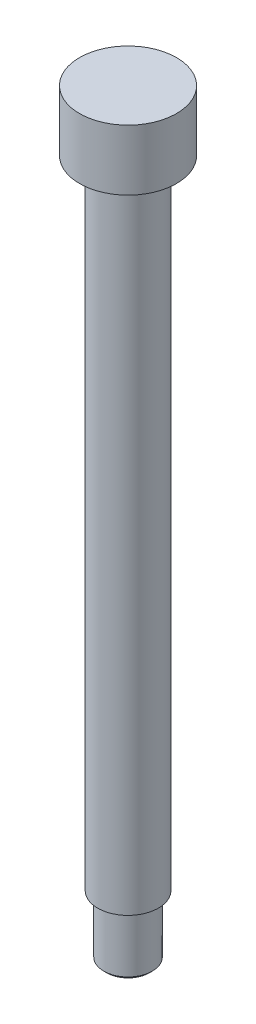
ISO-10303-21;
HEADER;
FILE_DESCRIPTION(('STEP AP214'),'2;1');
FILE_NAME('part.step','',(''),(''),'','','');
FILE_SCHEMA(('AUTOMOTIVE_DESIGN { 1 0 10303 214 1 1 1 1 }'));
ENDSEC;
DATA;
#1=APPLICATION_CONTEXT('core data for automotive mechanical design processes');
#2=APPLICATION_PROTOCOL_DEFINITION('international standard','automotive_design',2000,#1);
#3=PRODUCT_CONTEXT('',#1,'mechanical');
#4=PRODUCT('Part','Part','',(#3));
#5=PRODUCT_RELATED_PRODUCT_CATEGORY('part','',(#4));
#6=PRODUCT_DEFINITION_FORMATION('','',#4);
#7=PRODUCT_DEFINITION_CONTEXT('part definition',#1,'design');
#8=PRODUCT_DEFINITION('design','',#6,#7);
#9=PRODUCT_DEFINITION_SHAPE('','',#8);
#10=(LENGTH_UNIT() NAMED_UNIT(*) SI_UNIT(.MILLI.,.METRE.));
#11=(NAMED_UNIT(*) PLANE_ANGLE_UNIT() SI_UNIT($,.RADIAN.));
#12=(NAMED_UNIT(*) SI_UNIT($,.STERADIAN.) SOLID_ANGLE_UNIT());
#13=UNCERTAINTY_MEASURE_WITH_UNIT(LENGTH_MEASURE(1.E-05),#10,'distance_accuracy_value','');
#14=(GEOMETRIC_REPRESENTATION_CONTEXT(3) GLOBAL_UNCERTAINTY_ASSIGNED_CONTEXT((#13)) GLOBAL_UNIT_ASSIGNED_CONTEXT((#10,
#11,#12)) REPRESENTATION_CONTEXT('',''));
#15=CARTESIAN_POINT('',(0.,0.,0.));
#16=DIRECTION('',(0.,0.,1.));
#17=DIRECTION('',(1.,0.,0.));
#18=AXIS2_PLACEMENT_3D('',#15,#16,#17);
#19=CARTESIAN_POINT('',(0.,0.,0.));
#20=DIRECTION('',(0.,1.,0.));
#21=DIRECTION('',(0.,0.,1.));
#22=AXIS2_PLACEMENT_3D('',#19,#20,#21);
#23=PLANE('',#22);
#24=CARTESIAN_POINT('',(0.,0.,0.));
#25=DIRECTION('',(0.,-1.,0.));
#26=DIRECTION('',(0.,0.,-1.));
#27=AXIS2_PLACEMENT_3D('',#24,#25,#26);
#28=CIRCLE('',#27,8.);
#29=CARTESIAN_POINT('',(0.,0.,-8.));
#30=VERTEX_POINT('',#29);
#31=EDGE_CURVE('E61',#30,#30,#28,.T.);
#32=ORIENTED_EDGE('',*,*,#31,.F.);
#33=EDGE_LOOP('',(#32));
#34=FACE_BOUND('',#33,.T.);
#35=ADVANCED_FACE('F49',(#34),#23,.T.);
#36=CARTESIAN_POINT('',(0.,-130.,0.));
#37=DIRECTION('',(0.,-1.,0.));
#38=DIRECTION('',(0.,0.,-1.));
#39=AXIS2_PLACEMENT_3D('',#36,#37,#38);
#40=CYLINDRICAL_SURFACE('',#39,8.);
#41=ORIENTED_EDGE('',*,*,#31,.T.);
#42=EDGE_LOOP('',(#41));
#43=FACE_BOUND('',#42,.T.);
#44=CARTESIAN_POINT('',(0.,-9.99999999999999,0.));
#45=DIRECTION('',(0.,-1.,0.));
#46=DIRECTION('',(0.,0.,-1.));
#47=AXIS2_PLACEMENT_3D('',#44,#45,#46);
#48=CIRCLE('',#47,8.);
#49=CARTESIAN_POINT('',(0.,-9.99999999999999,-8.));
#50=VERTEX_POINT('',#49);
#51=EDGE_CURVE('E65',#50,#50,#48,.T.);
#52=ORIENTED_EDGE('',*,*,#51,.F.);
#53=EDGE_LOOP('',(#52));
#54=FACE_BOUND('',#53,.T.);
#55=ADVANCED_FACE('F98',(#43,#54),#40,.T.);
#56=CARTESIAN_POINT('',(5.,-10.,0.));
#57=DIRECTION('',(0.,-1.,0.));
#58=DIRECTION('',(0.,0.,-1.));
#59=AXIS2_PLACEMENT_3D('',#56,#57,#58);
#60=PLANE('',#59);
#61=ORIENTED_EDGE('',*,*,#51,.T.);
#62=EDGE_LOOP('',(#61));
#63=FACE_BOUND('',#62,.T.);
#64=CARTESIAN_POINT('',(0.,-9.99999999999999,0.));
#65=DIRECTION('',(0.,-1.,0.));
#66=DIRECTION('',(0.,0.,-1.));
#67=AXIS2_PLACEMENT_3D('',#64,#65,#66);
#68=CIRCLE('',#67,5.);
#69=CARTESIAN_POINT('',(0.,-9.99999999999999,-5.));
#70=VERTEX_POINT('',#69);
#71=EDGE_CURVE('E70',#70,#70,#68,.T.);
#72=ORIENTED_EDGE('',*,*,#71,.F.);
#73=EDGE_LOOP('',(#72));
#74=FACE_BOUND('',#73,.T.);
#75=ADVANCED_FACE('F94',(#63,#74),#60,.T.);
#76=CARTESIAN_POINT('',(0.,-130.,0.));
#77=DIRECTION('',(0.,-1.,0.));
#78=DIRECTION('',(0.,0.,-1.));
#79=AXIS2_PLACEMENT_3D('',#76,#77,#78);
#80=CYLINDRICAL_SURFACE('',#79,5.00000000000001);
#81=ORIENTED_EDGE('',*,*,#71,.T.);
#82=EDGE_LOOP('',(#81));
#83=FACE_BOUND('',#82,.T.);
#84=CARTESIAN_POINT('',(0.,-115.,0.));
#85=DIRECTION('',(0.,-1.,0.));
#86=DIRECTION('',(0.,0.,-1.));
#87=AXIS2_PLACEMENT_3D('',#84,#85,#86);
#88=CIRCLE('',#87,5.00000000000001);
#89=CARTESIAN_POINT('',(0.,-115.,-5.00000000000001));
#90=VERTEX_POINT('',#89);
#91=EDGE_CURVE('E73',#90,#90,#88,.T.);
#92=ORIENTED_EDGE('',*,*,#91,.F.);
#93=EDGE_LOOP('',(#92));
#94=FACE_BOUND('',#93,.T.);
#95=ADVANCED_FACE('F84',(#83,#94),#80,.T.);
#96=CARTESIAN_POINT('',(5.00000000000001,-115.,0.));
#97=DIRECTION('',(0.,-1.,0.));
#98=DIRECTION('',(0.,0.,-1.));
#99=AXIS2_PLACEMENT_3D('',#96,#97,#98);
#100=PLANE('',#99);
#101=ORIENTED_EDGE('',*,*,#91,.T.);
#102=EDGE_LOOP('',(#101));
#103=FACE_BOUND('',#102,.T.);
#104=CARTESIAN_POINT('',(0.,-115.,0.));
#105=DIRECTION('',(0.,-1.,0.));
#106=DIRECTION('',(0.,0.,-1.));
#107=AXIS2_PLACEMENT_3D('',#104,#105,#106);
#108=CIRCLE('',#107,4.);
#109=CARTESIAN_POINT('',(0.,-115.,-4.));
#110=VERTEX_POINT('',#109);
#111=EDGE_CURVE('E76',#110,#110,#108,.T.);
#112=ORIENTED_EDGE('',*,*,#111,.F.);
#113=EDGE_LOOP('',(#112));
#114=FACE_BOUND('',#113,.T.);
#115=ADVANCED_FACE('F82',(#103,#114),#100,.T.);
#116=CARTESIAN_POINT('',(0.,-130.,0.));
#117=DIRECTION('',(0.,-1.,0.));
#118=DIRECTION('',(0.,0.,-1.));
#119=AXIS2_PLACEMENT_3D('',#116,#117,#118);
#120=CYLINDRICAL_SURFACE('',#119,4.);
#121=CARTESIAN_POINT('',(0.,-124.5,0.));
#122=DIRECTION('',(0.,-1.,0.));
#123=DIRECTION('',(0.,0.,-1.));
#124=AXIS2_PLACEMENT_3D('',#121,#122,#123);
#125=CIRCLE('',#124,4.);
#126=CARTESIAN_POINT('',(0.,-124.5,-4.));
#127=VERTEX_POINT('',#126);
#128=EDGE_CURVE('E10',#127,#127,#125,.F.);
#129=ORIENTED_EDGE('',*,*,#128,.T.);
#130=EDGE_LOOP('',(#129));
#131=FACE_BOUND('',#130,.T.);
#132=ORIENTED_EDGE('',*,*,#111,.T.);
#133=EDGE_LOOP('',(#132));
#134=FACE_BOUND('',#133,.T.);
#135=ADVANCED_FACE('F80',(#131,#134),#120,.T.);
#136=CARTESIAN_POINT('',(4.,-125.,0.));
#137=DIRECTION('',(0.,-1.,0.));
#138=DIRECTION('',(0.,0.,-1.));
#139=AXIS2_PLACEMENT_3D('',#136,#137,#138);
#140=PLANE('',#139);
#141=CARTESIAN_POINT('',(0.,-125.,0.));
#142=DIRECTION('',(0.,-1.,0.));
#143=DIRECTION('',(0.,0.,-1.));
#144=AXIS2_PLACEMENT_3D('',#141,#142,#143);
#145=CIRCLE('',#144,3.50000000000004);
#146=CARTESIAN_POINT('',(0.,-125.,-3.50000000000004));
#147=VERTEX_POINT('',#146);
#148=EDGE_CURVE('E57',#147,#147,#145,.T.);
#149=ORIENTED_EDGE('',*,*,#148,.T.);
#150=EDGE_LOOP('',(#149));
#151=FACE_BOUND('',#150,.T.);
#152=ADVANCED_FACE('F92',(#151),#140,.T.);
#153=CARTESIAN_POINT('',(0.,-125.,0.));
#154=DIRECTION('',(0.,1.,0.));
#155=DIRECTION('',(0.,0.,1.));
#156=AXIS2_PLACEMENT_3D('',#153,#154,#155);
#157=CONICAL_SURFACE('',#156,3.50000000000004,0.785398163397448);
#158=ORIENTED_EDGE('',*,*,#128,.F.);
#159=EDGE_LOOP('',(#158));
#160=FACE_BOUND('',#159,.T.);
#161=ORIENTED_EDGE('',*,*,#148,.F.);
#162=EDGE_LOOP('',(#161));
#163=FACE_BOUND('',#162,.T.);
#164=ADVANCED_FACE('F52',(#160,#163),#157,.T.);
#165=CLOSED_SHELL('',(#35,#55,#75,#95,#115,#135,#152,#164));
#166=MANIFOLD_SOLID_BREP('B2',#165);
#167=ADVANCED_BREP_SHAPE_REPRESENTATION('',(#18,#166),#14);
#168=SHAPE_DEFINITION_REPRESENTATION(#9,#167);
ENDSEC;
END-ISO-10303-21;
